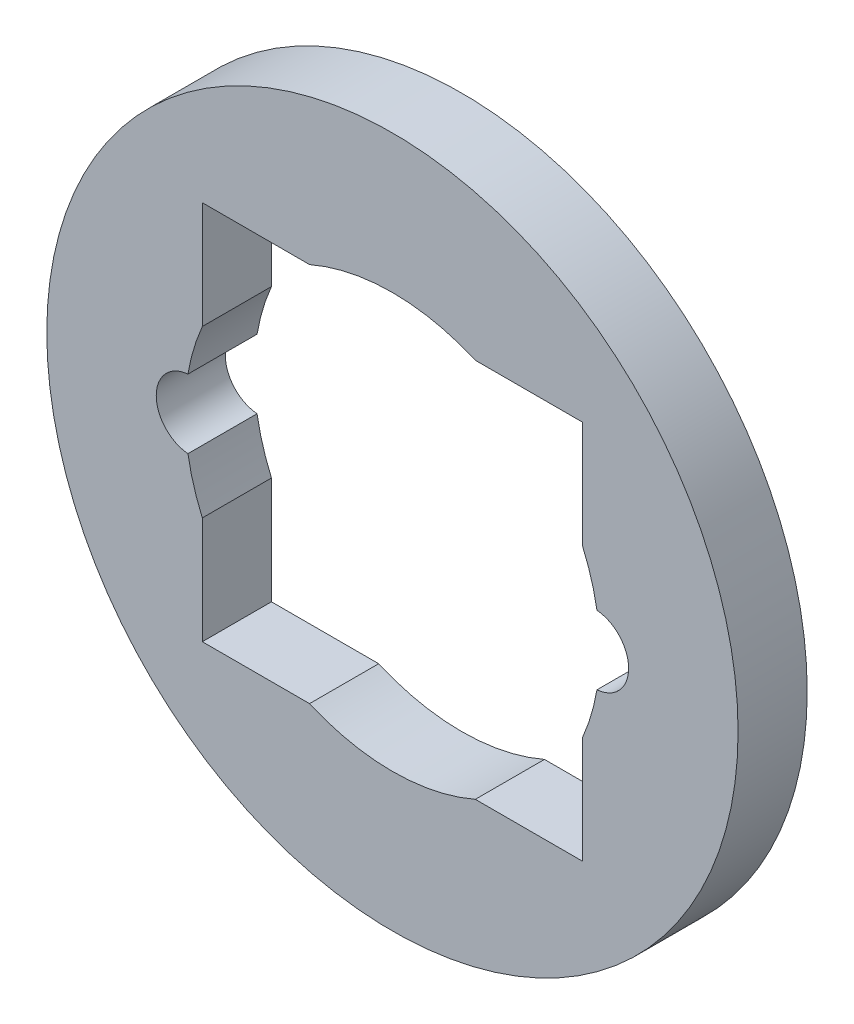
ISO-10303-21;
HEADER;
FILE_DESCRIPTION(('STEP AP214'),'2;1');
FILE_NAME('part.step','',(''),(''),'','','');
FILE_SCHEMA(('AUTOMOTIVE_DESIGN { 1 0 10303 214 1 1 1 1 }'));
ENDSEC;
DATA;
#1=APPLICATION_CONTEXT('core data for automotive mechanical design processes');
#2=APPLICATION_PROTOCOL_DEFINITION('international standard','automotive_design',2000,#1);
#3=PRODUCT_CONTEXT('',#1,'mechanical');
#4=PRODUCT('Part','Part','',(#3));
#5=PRODUCT_RELATED_PRODUCT_CATEGORY('part','',(#4));
#6=PRODUCT_DEFINITION_FORMATION('','',#4);
#7=PRODUCT_DEFINITION_CONTEXT('part definition',#1,'design');
#8=PRODUCT_DEFINITION('design','',#6,#7);
#9=PRODUCT_DEFINITION_SHAPE('','',#8);
#10=(LENGTH_UNIT() NAMED_UNIT(*) SI_UNIT(.MILLI.,.METRE.));
#11=(NAMED_UNIT(*) PLANE_ANGLE_UNIT() SI_UNIT($,.RADIAN.));
#12=(NAMED_UNIT(*) SI_UNIT($,.STERADIAN.) SOLID_ANGLE_UNIT());
#13=UNCERTAINTY_MEASURE_WITH_UNIT(LENGTH_MEASURE(1.E-05),#10,'distance_accuracy_value','');
#14=(GEOMETRIC_REPRESENTATION_CONTEXT(3) GLOBAL_UNCERTAINTY_ASSIGNED_CONTEXT((#13)) GLOBAL_UNIT_ASSIGNED_CONTEXT((#10,
#11,#12)) REPRESENTATION_CONTEXT('',''));
#15=CARTESIAN_POINT('',(0.,0.,0.));
#16=DIRECTION('',(0.,0.,1.));
#17=DIRECTION('',(1.,0.,0.));
#18=AXIS2_PLACEMENT_3D('',#15,#16,#17);
#19=CARTESIAN_POINT('',(0.,0.,3.));
#20=DIRECTION('',(0.,0.,-1.));
#21=DIRECTION('',(-1.,0.,0.));
#22=AXIS2_PLACEMENT_3D('',#19,#20,#21);
#23=CYLINDRICAL_SURFACE('',#22,9.00000000000001);
#24=CARTESIAN_POINT('',(0.,0.,0.));
#25=DIRECTION('',(0.,0.,1.));
#26=DIRECTION('',(1.,0.,0.));
#27=AXIS2_PLACEMENT_3D('',#24,#25,#26);
#28=CIRCLE('',#27,9.00000000000001);
#29=CARTESIAN_POINT('',(8.87499999999998,1.49478259288783,0.));
#30=VERTEX_POINT('',#29);
#31=CARTESIAN_POINT('',(8.25000000000026,3.59687364248397,0.));
#32=VERTEX_POINT('',#31);
#33=EDGE_CURVE('E179',#30,#32,#28,.T.);
#34=ORIENTED_EDGE('',*,*,#33,.F.);
#35=DIRECTION('',(0.,0.,-1.));
#36=VECTOR('',#35,1.);
#37=CARTESIAN_POINT('',(8.87499999999998,1.49478259288783,3.));
#38=LINE('',#37,#36);
#39=CARTESIAN_POINT('',(8.87499999999998,1.49478259288783,3.));
#40=VERTEX_POINT('',#39);
#41=EDGE_CURVE('E11',#40,#30,#38,.T.);
#42=ORIENTED_EDGE('',*,*,#41,.F.);
#43=CARTESIAN_POINT('',(0.,0.,3.));
#44=DIRECTION('',(0.,0.,1.));
#45=DIRECTION('',(1.,0.,0.));
#46=AXIS2_PLACEMENT_3D('',#43,#44,#45);
#47=CIRCLE('',#46,9.00000000000001);
#48=CARTESIAN_POINT('',(8.25000000000026,3.59687364248397,3.));
#49=VERTEX_POINT('',#48);
#50=EDGE_CURVE('E222',#40,#49,#47,.T.);
#51=ORIENTED_EDGE('',*,*,#50,.T.);
#52=DIRECTION('',(0.,0.,-1.));
#53=VECTOR('',#52,1.);
#54=CARTESIAN_POINT('',(8.25000000000026,3.59687364248397,3.));
#55=LINE('',#54,#53);
#56=EDGE_CURVE('E108',#49,#32,#55,.T.);
#57=ORIENTED_EDGE('',*,*,#56,.T.);
#58=EDGE_LOOP('',(#34,#42,#51,#57));
#59=FACE_BOUND('',#58,.T.);
#60=ADVANCED_FACE('F34',(#59),#23,.F.);
#61=CARTESIAN_POINT('',(8.75000000000026,1.31838984174237E-13,3.));
#62=DIRECTION('',(0.,0.,-1.));
#63=DIRECTION('',(-1.,0.,0.));
#64=AXIS2_PLACEMENT_3D('',#61,#62,#63);
#65=CYLINDRICAL_SURFACE('',#64,1.5);
#66=CARTESIAN_POINT('',(8.75000000000026,1.31838984174237E-13,0.));
#67=DIRECTION('',(0.,0.,1.));
#68=DIRECTION('',(1.,0.,0.));
#69=AXIS2_PLACEMENT_3D('',#66,#67,#68);
#70=CIRCLE('',#69,1.5);
#71=CARTESIAN_POINT('',(8.87500000000002,-1.49478259288757,0.));
#72=VERTEX_POINT('',#71);
#73=EDGE_CURVE('E182',#72,#30,#70,.T.);
#74=ORIENTED_EDGE('',*,*,#73,.F.);
#75=DIRECTION('',(0.,0.,-1.));
#76=VECTOR('',#75,1.);
#77=CARTESIAN_POINT('',(8.87500000000002,-1.49478259288757,3.));
#78=LINE('',#77,#76);
#79=CARTESIAN_POINT('',(8.87500000000002,-1.49478259288757,3.));
#80=VERTEX_POINT('',#79);
#81=EDGE_CURVE('E42',#80,#72,#78,.T.);
#82=ORIENTED_EDGE('',*,*,#81,.F.);
#83=CARTESIAN_POINT('',(8.75000000000026,1.31838984174237E-13,3.));
#84=DIRECTION('',(0.,0.,1.));
#85=DIRECTION('',(1.,0.,0.));
#86=AXIS2_PLACEMENT_3D('',#83,#84,#85);
#87=CIRCLE('',#86,1.5);
#88=EDGE_CURVE('E307',#80,#40,#87,.T.);
#89=ORIENTED_EDGE('',*,*,#88,.T.);
#90=ORIENTED_EDGE('',*,*,#41,.T.);
#91=EDGE_LOOP('',(#74,#82,#89,#90));
#92=FACE_BOUND('',#91,.T.);
#93=ADVANCED_FACE('F258',(#92),#65,.F.);
#94=CARTESIAN_POINT('',(0.,0.,3.));
#95=DIRECTION('',(0.,0.,-1.));
#96=DIRECTION('',(-1.,0.,0.));
#97=AXIS2_PLACEMENT_3D('',#94,#95,#96);
#98=CYLINDRICAL_SURFACE('',#97,9.00000000000001);
#99=CARTESIAN_POINT('',(0.,0.,0.));
#100=DIRECTION('',(0.,0.,1.));
#101=DIRECTION('',(1.,0.,0.));
#102=AXIS2_PLACEMENT_3D('',#99,#100,#101);
#103=CIRCLE('',#102,9.00000000000001);
#104=CARTESIAN_POINT('',(8.25000000000026,-3.59687364248397,0.));
#105=VERTEX_POINT('',#104);
#106=EDGE_CURVE('E185',#105,#72,#103,.T.);
#107=ORIENTED_EDGE('',*,*,#106,.F.);
#108=DIRECTION('',(0.,0.,-1.));
#109=VECTOR('',#108,1.);
#110=CARTESIAN_POINT('',(8.25000000000026,-3.59687364248397,3.));
#111=LINE('',#110,#109);
#112=CARTESIAN_POINT('',(8.25000000000026,-3.59687364248397,3.));
#113=VERTEX_POINT('',#112);
#114=EDGE_CURVE('E247',#113,#105,#111,.T.);
#115=ORIENTED_EDGE('',*,*,#114,.F.);
#116=CARTESIAN_POINT('',(0.,0.,3.));
#117=DIRECTION('',(0.,0.,1.));
#118=DIRECTION('',(1.,0.,0.));
#119=AXIS2_PLACEMENT_3D('',#116,#117,#118);
#120=CIRCLE('',#119,9.00000000000001);
#121=EDGE_CURVE('E254',#113,#80,#120,.T.);
#122=ORIENTED_EDGE('',*,*,#121,.T.);
#123=ORIENTED_EDGE('',*,*,#81,.T.);
#124=EDGE_LOOP('',(#107,#115,#122,#123));
#125=FACE_BOUND('',#124,.T.);
#126=ADVANCED_FACE('F252',(#125),#98,.F.);
#127=CARTESIAN_POINT('',(8.25000000000026,-71.8814307783956,3.));
#128=DIRECTION('',(1.,0.,0.));
#129=DIRECTION('',(0.,0.,-1.));
#130=AXIS2_PLACEMENT_3D('',#127,#128,#129);
#131=PLANE('',#130);
#132=DIRECTION('',(0.,-1.,0.));
#133=VECTOR('',#132,1.);
#134=CARTESIAN_POINT('',(8.25000000000026,-71.8814307783956,0.));
#135=LINE('',#134,#133);
#136=CARTESIAN_POINT('',(8.25000000000026,-8.24999999999987,0.));
#137=VERTEX_POINT('',#136);
#138=EDGE_CURVE('E188',#105,#137,#135,.T.);
#139=ORIENTED_EDGE('',*,*,#138,.T.);
#140=DIRECTION('',(0.,0.,-1.));
#141=VECTOR('',#140,1.);
#142=CARTESIAN_POINT('',(8.25000000000026,-8.24999999999987,3.));
#143=LINE('',#142,#141);
#144=CARTESIAN_POINT('',(8.25000000000026,-8.24999999999987,3.));
#145=VERTEX_POINT('',#144);
#146=EDGE_CURVE('E244',#145,#137,#143,.T.);
#147=ORIENTED_EDGE('',*,*,#146,.F.);
#148=DIRECTION('',(0.,-1.,0.));
#149=VECTOR('',#148,1.);
#150=CARTESIAN_POINT('',(8.25000000000026,-71.8814307783956,3.));
#151=LINE('',#150,#149);
#152=EDGE_CURVE('E276',#113,#145,#151,.T.);
#153=ORIENTED_EDGE('',*,*,#152,.F.);
#154=ORIENTED_EDGE('',*,*,#114,.T.);
#155=EDGE_LOOP('',(#139,#147,#153,#154));
#156=FACE_BOUND('',#155,.T.);
#157=ADVANCED_FACE('F266',(#156),#131,.F.);
#158=CARTESIAN_POINT('',(0.784569074154751,-8.24999999999987,3.));
#159=DIRECTION('',(0.,-1.,0.));
#160=DIRECTION('',(0.,0.,-1.));
#161=AXIS2_PLACEMENT_3D('',#158,#159,#160);
#162=PLANE('',#161);
#163=DIRECTION('',(-1.,0.,0.));
#164=VECTOR('',#163,1.);
#165=CARTESIAN_POINT('',(0.784569074154751,-8.24999999999987,0.));
#166=LINE('',#165,#164);
#167=CARTESIAN_POINT('',(3.59687364248484,-8.24999999999987,0.));
#168=VERTEX_POINT('',#167);
#169=EDGE_CURVE('E190',#137,#168,#166,.T.);
#170=ORIENTED_EDGE('',*,*,#169,.T.);
#171=DIRECTION('',(0.,0.,-1.));
#172=VECTOR('',#171,1.);
#173=CARTESIAN_POINT('',(3.59687364248484,-8.24999999999987,3.));
#174=LINE('',#173,#172);
#175=CARTESIAN_POINT('',(3.59687364248484,-8.24999999999987,3.));
#176=VERTEX_POINT('',#175);
#177=EDGE_CURVE('E242',#176,#168,#174,.T.);
#178=ORIENTED_EDGE('',*,*,#177,.F.);
#179=DIRECTION('',(-1.,0.,0.));
#180=VECTOR('',#179,1.);
#181=CARTESIAN_POINT('',(0.784569074154751,-8.24999999999987,3.));
#182=LINE('',#181,#180);
#183=EDGE_CURVE('E272',#145,#176,#182,.T.);
#184=ORIENTED_EDGE('',*,*,#183,.F.);
#185=ORIENTED_EDGE('',*,*,#146,.T.);
#186=EDGE_LOOP('',(#170,#178,#184,#185));
#187=FACE_BOUND('',#186,.T.);
#188=ADVANCED_FACE('F270',(#187),#162,.F.);
#189=CARTESIAN_POINT('',(0.,0.,3.));
#190=DIRECTION('',(0.,0.,-1.));
#191=DIRECTION('',(-1.,0.,0.));
#192=AXIS2_PLACEMENT_3D('',#189,#190,#191);
#193=CYLINDRICAL_SURFACE('',#192,9.);
#194=CARTESIAN_POINT('',(0.,0.,0.));
#195=DIRECTION('',(0.,0.,1.));
#196=DIRECTION('',(1.,0.,0.));
#197=AXIS2_PLACEMENT_3D('',#194,#195,#196);
#198=CIRCLE('',#197,9.);
#199=CARTESIAN_POINT('',(-3.59687364248485,-8.24999999999987,0.));
#200=VERTEX_POINT('',#199);
#201=EDGE_CURVE('E193',#200,#168,#198,.T.);
#202=ORIENTED_EDGE('',*,*,#201,.F.);
#203=DIRECTION('',(0.,0.,-1.));
#204=VECTOR('',#203,1.);
#205=CARTESIAN_POINT('',(-3.59687364248485,-8.24999999999987,3.));
#206=LINE('',#205,#204);
#207=CARTESIAN_POINT('',(-3.59687364248485,-8.24999999999987,3.));
#208=VERTEX_POINT('',#207);
#209=EDGE_CURVE('E240',#208,#200,#206,.T.);
#210=ORIENTED_EDGE('',*,*,#209,.F.);
#211=CARTESIAN_POINT('',(0.,0.,3.));
#212=DIRECTION('',(0.,0.,1.));
#213=DIRECTION('',(1.,0.,0.));
#214=AXIS2_PLACEMENT_3D('',#211,#212,#213);
#215=CIRCLE('',#214,9.);
#216=EDGE_CURVE('E275',#208,#176,#215,.T.);
#217=ORIENTED_EDGE('',*,*,#216,.T.);
#218=ORIENTED_EDGE('',*,*,#177,.T.);
#219=EDGE_LOOP('',(#202,#210,#217,#218));
#220=FACE_BOUND('',#219,.T.);
#221=ADVANCED_FACE('F323',(#220),#193,.F.);
#222=CARTESIAN_POINT('',(0.784569074154751,-8.24999999999987,3.));
#223=DIRECTION('',(0.,-1.,0.));
#224=DIRECTION('',(0.,0.,-1.));
#225=AXIS2_PLACEMENT_3D('',#222,#223,#224);
#226=PLANE('',#225);
#227=DIRECTION('',(-1.,0.,0.));
#228=VECTOR('',#227,1.);
#229=CARTESIAN_POINT('',(0.784569074154751,-8.24999999999987,0.));
#230=LINE('',#229,#228);
#231=CARTESIAN_POINT('',(-8.24999999999976,-8.24999999999987,0.));
#232=VERTEX_POINT('',#231);
#233=EDGE_CURVE('E196',#200,#232,#230,.T.);
#234=ORIENTED_EDGE('',*,*,#233,.T.);
#235=DIRECTION('',(0.,0.,-1.));
#236=VECTOR('',#235,1.);
#237=CARTESIAN_POINT('',(-8.24999999999976,-8.24999999999987,3.));
#238=LINE('',#237,#236);
#239=CARTESIAN_POINT('',(-8.24999999999976,-8.24999999999987,3.));
#240=VERTEX_POINT('',#239);
#241=EDGE_CURVE('E237',#240,#232,#238,.T.);
#242=ORIENTED_EDGE('',*,*,#241,.F.);
#243=DIRECTION('',(-1.,0.,0.));
#244=VECTOR('',#243,1.);
#245=CARTESIAN_POINT('',(0.784569074154751,-8.24999999999987,3.));
#246=LINE('',#245,#244);
#247=EDGE_CURVE('E278',#208,#240,#246,.T.);
#248=ORIENTED_EDGE('',*,*,#247,.F.);
#249=ORIENTED_EDGE('',*,*,#209,.T.);
#250=EDGE_LOOP('',(#234,#242,#248,#249));
#251=FACE_BOUND('',#250,.T.);
#252=ADVANCED_FACE('F326',(#251),#226,.F.);
#253=CARTESIAN_POINT('',(-8.24999999999976,-71.8814307783956,3.));
#254=DIRECTION('',(-1.,0.,0.));
#255=DIRECTION('',(0.,0.,1.));
#256=AXIS2_PLACEMENT_3D('',#253,#254,#255);
#257=PLANE('',#256);
#258=DIRECTION('',(0.,1.,0.));
#259=VECTOR('',#258,1.);
#260=CARTESIAN_POINT('',(-8.24999999999976,-71.8814307783956,0.));
#261=LINE('',#260,#259);
#262=CARTESIAN_POINT('',(-8.24999999999976,-3.59687364248513,0.));
#263=VERTEX_POINT('',#262);
#264=EDGE_CURVE('E198',#232,#263,#261,.T.);
#265=ORIENTED_EDGE('',*,*,#264,.T.);
#266=DIRECTION('',(0.,0.,-1.));
#267=VECTOR('',#266,1.);
#268=CARTESIAN_POINT('',(-8.24999999999976,-3.59687364248513,3.));
#269=LINE('',#268,#267);
#270=CARTESIAN_POINT('',(-8.24999999999976,-3.59687364248513,3.));
#271=VERTEX_POINT('',#270);
#272=EDGE_CURVE('E235',#271,#263,#269,.T.);
#273=ORIENTED_EDGE('',*,*,#272,.F.);
#274=DIRECTION('',(0.,1.,0.));
#275=VECTOR('',#274,1.);
#276=CARTESIAN_POINT('',(-8.24999999999976,-71.8814307783956,3.));
#277=LINE('',#276,#275);
#278=EDGE_CURVE('E284',#240,#271,#277,.T.);
#279=ORIENTED_EDGE('',*,*,#278,.F.);
#280=ORIENTED_EDGE('',*,*,#241,.T.);
#281=EDGE_LOOP('',(#265,#273,#279,#280));
#282=FACE_BOUND('',#281,.T.);
#283=ADVANCED_FACE('F330',(#282),#257,.F.);
#284=CARTESIAN_POINT('',(0.,0.,3.));
#285=DIRECTION('',(0.,0.,-1.));
#286=DIRECTION('',(-1.,0.,0.));
#287=AXIS2_PLACEMENT_3D('',#284,#285,#286);
#288=CYLINDRICAL_SURFACE('',#287,9.00000000000001);
#289=CARTESIAN_POINT('',(0.,0.,0.));
#290=DIRECTION('',(0.,0.,1.));
#291=DIRECTION('',(1.,0.,0.));
#292=AXIS2_PLACEMENT_3D('',#289,#290,#291);
#293=CIRCLE('',#292,9.00000000000001);
#294=CARTESIAN_POINT('',(-8.87500000000004,-1.49478259288753,0.));
#295=VERTEX_POINT('',#294);
#296=EDGE_CURVE('E201',#295,#263,#293,.T.);
#297=ORIENTED_EDGE('',*,*,#296,.F.);
#298=DIRECTION('',(0.,0.,-1.));
#299=VECTOR('',#298,1.);
#300=CARTESIAN_POINT('',(-8.87500000000004,-1.49478259288753,3.));
#301=LINE('',#300,#299);
#302=CARTESIAN_POINT('',(-8.87500000000004,-1.49478259288753,3.));
#303=VERTEX_POINT('',#302);
#304=EDGE_CURVE('E233',#303,#295,#301,.T.);
#305=ORIENTED_EDGE('',*,*,#304,.F.);
#306=CARTESIAN_POINT('',(0.,0.,3.));
#307=DIRECTION('',(0.,0.,1.));
#308=DIRECTION('',(1.,0.,0.));
#309=AXIS2_PLACEMENT_3D('',#306,#307,#308);
#310=CIRCLE('',#309,9.00000000000001);
#311=EDGE_CURVE('E286',#303,#271,#310,.T.);
#312=ORIENTED_EDGE('',*,*,#311,.T.);
#313=ORIENTED_EDGE('',*,*,#272,.T.);
#314=EDGE_LOOP('',(#297,#305,#312,#313));
#315=FACE_BOUND('',#314,.T.);
#316=ADVANCED_FACE('F334',(#315),#288,.F.);
#317=CARTESIAN_POINT('',(-8.74999999999976,1.31838984174237E-13,3.));
#318=DIRECTION('',(0.,0.,-1.));
#319=DIRECTION('',(-1.,0.,0.));
#320=AXIS2_PLACEMENT_3D('',#317,#318,#319);
#321=CYLINDRICAL_SURFACE('',#320,1.50000000000001);
#322=CARTESIAN_POINT('',(-8.74999999999976,1.31838984174237E-13,0.));
#323=DIRECTION('',(0.,0.,1.));
#324=DIRECTION('',(1.,0.,0.));
#325=AXIS2_PLACEMENT_3D('',#322,#323,#324);
#326=CIRCLE('',#325,1.50000000000001);
#327=CARTESIAN_POINT('',(-8.875,1.4947825928878,0.));
#328=VERTEX_POINT('',#327);
#329=EDGE_CURVE('E204',#328,#295,#326,.T.);
#330=ORIENTED_EDGE('',*,*,#329,.F.);
#331=DIRECTION('',(0.,0.,-1.));
#332=VECTOR('',#331,1.);
#333=CARTESIAN_POINT('',(-8.875,1.4947825928878,3.));
#334=LINE('',#333,#332);
#335=CARTESIAN_POINT('',(-8.875,1.4947825928878,3.));
#336=VERTEX_POINT('',#335);
#337=EDGE_CURVE('E231',#336,#328,#334,.T.);
#338=ORIENTED_EDGE('',*,*,#337,.F.);
#339=CARTESIAN_POINT('',(-8.74999999999976,1.31838984174237E-13,3.));
#340=DIRECTION('',(0.,0.,1.));
#341=DIRECTION('',(1.,0.,0.));
#342=AXIS2_PLACEMENT_3D('',#339,#340,#341);
#343=CIRCLE('',#342,1.50000000000001);
#344=EDGE_CURVE('E289',#336,#303,#343,.T.);
#345=ORIENTED_EDGE('',*,*,#344,.T.);
#346=ORIENTED_EDGE('',*,*,#304,.T.);
#347=EDGE_LOOP('',(#330,#338,#345,#346));
#348=FACE_BOUND('',#347,.T.);
#349=ADVANCED_FACE('F338',(#348),#321,.F.);
#350=CARTESIAN_POINT('',(0.,0.,3.));
#351=DIRECTION('',(0.,0.,-1.));
#352=DIRECTION('',(-1.,0.,0.));
#353=AXIS2_PLACEMENT_3D('',#350,#351,#352);
#354=CYLINDRICAL_SURFACE('',#353,9.00000000000001);
#355=CARTESIAN_POINT('',(0.,0.,0.));
#356=DIRECTION('',(0.,0.,1.));
#357=DIRECTION('',(1.,0.,0.));
#358=AXIS2_PLACEMENT_3D('',#355,#356,#357);
#359=CIRCLE('',#358,9.00000000000001);
#360=CARTESIAN_POINT('',(-8.24999999999976,3.59687364248513,0.));
#361=VERTEX_POINT('',#360);
#362=EDGE_CURVE('E207',#361,#328,#359,.T.);
#363=ORIENTED_EDGE('',*,*,#362,.F.);
#364=DIRECTION('',(0.,0.,-1.));
#365=VECTOR('',#364,1.);
#366=CARTESIAN_POINT('',(-8.24999999999976,3.59687364248513,3.));
#367=LINE('',#366,#365);
#368=CARTESIAN_POINT('',(-8.24999999999976,3.59687364248513,3.));
#369=VERTEX_POINT('',#368);
#370=EDGE_CURVE('E229',#369,#361,#367,.T.);
#371=ORIENTED_EDGE('',*,*,#370,.F.);
#372=CARTESIAN_POINT('',(0.,0.,3.));
#373=DIRECTION('',(0.,0.,1.));
#374=DIRECTION('',(1.,0.,0.));
#375=AXIS2_PLACEMENT_3D('',#372,#373,#374);
#376=CIRCLE('',#375,9.00000000000001);
#377=EDGE_CURVE('E292',#369,#336,#376,.T.);
#378=ORIENTED_EDGE('',*,*,#377,.T.);
#379=ORIENTED_EDGE('',*,*,#337,.T.);
#380=EDGE_LOOP('',(#363,#371,#378,#379));
#381=FACE_BOUND('',#380,.T.);
#382=ADVANCED_FACE('F342',(#381),#354,.F.);
#383=CARTESIAN_POINT('',(-8.24999999999976,-71.8814307783956,3.));
#384=DIRECTION('',(-1.,0.,0.));
#385=DIRECTION('',(0.,0.,1.));
#386=AXIS2_PLACEMENT_3D('',#383,#384,#385);
#387=PLANE('',#386);
#388=DIRECTION('',(0.,1.,0.));
#389=VECTOR('',#388,1.);
#390=CARTESIAN_POINT('',(-8.24999999999976,-71.8814307783956,0.));
#391=LINE('',#390,#389);
#392=CARTESIAN_POINT('',(-8.24999999999976,8.25000000000015,0.));
#393=VERTEX_POINT('',#392);
#394=EDGE_CURVE('E210',#361,#393,#391,.T.);
#395=ORIENTED_EDGE('',*,*,#394,.T.);
#396=DIRECTION('',(0.,0.,-1.));
#397=VECTOR('',#396,1.);
#398=CARTESIAN_POINT('',(-8.24999999999976,8.25000000000015,3.));
#399=LINE('',#398,#397);
#400=CARTESIAN_POINT('',(-8.24999999999976,8.25000000000015,3.));
#401=VERTEX_POINT('',#400);
#402=EDGE_CURVE('E226',#401,#393,#399,.T.);
#403=ORIENTED_EDGE('',*,*,#402,.F.);
#404=DIRECTION('',(0.,1.,0.));
#405=VECTOR('',#404,1.);
#406=CARTESIAN_POINT('',(-8.24999999999976,-71.8814307783956,3.));
#407=LINE('',#406,#405);
#408=EDGE_CURVE('E171',#369,#401,#407,.T.);
#409=ORIENTED_EDGE('',*,*,#408,.F.);
#410=ORIENTED_EDGE('',*,*,#370,.T.);
#411=EDGE_LOOP('',(#395,#403,#409,#410));
#412=FACE_BOUND('',#411,.T.);
#413=ADVANCED_FACE('F299',(#412),#387,.F.);
#414=CARTESIAN_POINT('',(0.784569074154751,8.25000000000015,3.));
#415=DIRECTION('',(0.,1.,0.));
#416=DIRECTION('',(0.,0.,1.));
#417=AXIS2_PLACEMENT_3D('',#414,#415,#416);
#418=PLANE('',#417);
#419=DIRECTION('',(1.,0.,0.));
#420=VECTOR('',#419,1.);
#421=CARTESIAN_POINT('',(0.784569074154751,8.25000000000015,0.));
#422=LINE('',#421,#420);
#423=CARTESIAN_POINT('',(-3.5968736424842,8.25000000000015,0.));
#424=VERTEX_POINT('',#423);
#425=EDGE_CURVE('E212',#393,#424,#422,.T.);
#426=ORIENTED_EDGE('',*,*,#425,.T.);
#427=DIRECTION('',(0.,0.,-1.));
#428=VECTOR('',#427,1.);
#429=CARTESIAN_POINT('',(-3.5968736424842,8.25000000000015,3.));
#430=LINE('',#429,#428);
#431=CARTESIAN_POINT('',(-3.5968736424842,8.25000000000015,3.));
#432=VERTEX_POINT('',#431);
#433=EDGE_CURVE('E159',#432,#424,#430,.T.);
#434=ORIENTED_EDGE('',*,*,#433,.F.);
#435=DIRECTION('',(1.,0.,0.));
#436=VECTOR('',#435,1.);
#437=CARTESIAN_POINT('',(0.784569074154751,8.25000000000015,3.));
#438=LINE('',#437,#436);
#439=EDGE_CURVE('E168',#401,#432,#438,.T.);
#440=ORIENTED_EDGE('',*,*,#439,.F.);
#441=ORIENTED_EDGE('',*,*,#402,.T.);
#442=EDGE_LOOP('',(#426,#434,#440,#441));
#443=FACE_BOUND('',#442,.T.);
#444=ADVANCED_FACE('F303',(#443),#418,.F.);
#445=CARTESIAN_POINT('',(0.,0.,3.));
#446=DIRECTION('',(0.,0.,-1.));
#447=DIRECTION('',(-1.,0.,0.));
#448=AXIS2_PLACEMENT_3D('',#445,#446,#447);
#449=CYLINDRICAL_SURFACE('',#448,9.);
#450=CARTESIAN_POINT('',(0.,0.,0.));
#451=DIRECTION('',(0.,0.,1.));
#452=DIRECTION('',(1.,0.,0.));
#453=AXIS2_PLACEMENT_3D('',#450,#451,#452);
#454=CIRCLE('',#453,9.);
#455=CARTESIAN_POINT('',(3.59687364248423,8.25000000000013,0.));
#456=VERTEX_POINT('',#455);
#457=EDGE_CURVE('E158',#456,#424,#454,.T.);
#458=ORIENTED_EDGE('',*,*,#457,.F.);
#459=DIRECTION('',(0.,0.,-1.));
#460=VECTOR('',#459,1.);
#461=CARTESIAN_POINT('',(3.59687364248423,8.25000000000013,3.));
#462=LINE('',#461,#460);
#463=CARTESIAN_POINT('',(3.59687364248423,8.25000000000013,3.));
#464=VERTEX_POINT('',#463);
#465=EDGE_CURVE('E152',#464,#456,#462,.T.);
#466=ORIENTED_EDGE('',*,*,#465,.F.);
#467=CARTESIAN_POINT('',(0.,0.,3.));
#468=DIRECTION('',(0.,0.,1.));
#469=DIRECTION('',(1.,0.,0.));
#470=AXIS2_PLACEMENT_3D('',#467,#468,#469);
#471=CIRCLE('',#470,9.);
#472=EDGE_CURVE('E156',#464,#432,#471,.T.);
#473=ORIENTED_EDGE('',*,*,#472,.T.);
#474=ORIENTED_EDGE('',*,*,#433,.T.);
#475=EDGE_LOOP('',(#458,#466,#473,#474));
#476=FACE_BOUND('',#475,.T.);
#477=ADVANCED_FACE('F154',(#476),#449,.F.);
#478=CARTESIAN_POINT('',(0.784569074154751,8.25000000000013,3.));
#479=DIRECTION('',(0.,1.,0.));
#480=DIRECTION('',(0.,0.,1.));
#481=AXIS2_PLACEMENT_3D('',#478,#479,#480);
#482=PLANE('',#481);
#483=DIRECTION('',(1.,0.,0.));
#484=VECTOR('',#483,1.);
#485=CARTESIAN_POINT('',(0.784569074154751,8.25000000000013,0.));
#486=LINE('',#485,#484);
#487=CARTESIAN_POINT('',(8.25000000000026,8.25000000000013,0.));
#488=VERTEX_POINT('',#487);
#489=EDGE_CURVE('E101',#456,#488,#486,.T.);
#490=ORIENTED_EDGE('',*,*,#489,.T.);
#491=DIRECTION('',(0.,0.,-1.));
#492=VECTOR('',#491,1.);
#493=CARTESIAN_POINT('',(8.25000000000026,8.25000000000013,3.));
#494=LINE('',#493,#492);
#495=CARTESIAN_POINT('',(8.25000000000026,8.25000000000013,3.));
#496=VERTEX_POINT('',#495);
#497=EDGE_CURVE('E160',#496,#488,#494,.T.);
#498=ORIENTED_EDGE('',*,*,#497,.F.);
#499=DIRECTION('',(1.,0.,0.));
#500=VECTOR('',#499,1.);
#501=CARTESIAN_POINT('',(0.784569074154751,8.25000000000013,3.));
#502=LINE('',#501,#500);
#503=EDGE_CURVE('E162',#464,#496,#502,.T.);
#504=ORIENTED_EDGE('',*,*,#503,.F.);
#505=ORIENTED_EDGE('',*,*,#465,.T.);
#506=EDGE_LOOP('',(#490,#498,#504,#505));
#507=FACE_BOUND('',#506,.T.);
#508=ADVANCED_FACE('F163',(#507),#482,.F.);
#509=CARTESIAN_POINT('',(8.25000000000026,-71.8814307783956,3.));
#510=DIRECTION('',(1.,0.,0.));
#511=DIRECTION('',(0.,0.,-1.));
#512=AXIS2_PLACEMENT_3D('',#509,#510,#511);
#513=PLANE('',#512);
#514=DIRECTION('',(0.,-1.,0.));
#515=VECTOR('',#514,1.);
#516=CARTESIAN_POINT('',(8.25000000000026,-71.8814307783956,0.));
#517=LINE('',#516,#515);
#518=EDGE_CURVE('E217',#488,#32,#517,.T.);
#519=ORIENTED_EDGE('',*,*,#518,.T.);
#520=ORIENTED_EDGE('',*,*,#56,.F.);
#521=DIRECTION('',(0.,-1.,0.));
#522=VECTOR('',#521,1.);
#523=CARTESIAN_POINT('',(8.25000000000026,-71.8814307783956,3.));
#524=LINE('',#523,#522);
#525=EDGE_CURVE('E50',#496,#49,#524,.T.);
#526=ORIENTED_EDGE('',*,*,#525,.F.);
#527=ORIENTED_EDGE('',*,*,#497,.T.);
#528=EDGE_LOOP('',(#519,#520,#526,#527));
#529=FACE_BOUND('',#528,.T.);
#530=ADVANCED_FACE('F306',(#529),#513,.F.);
#531=CARTESIAN_POINT('',(0.,0.,3.));
#532=DIRECTION('',(0.,0.,-1.));
#533=DIRECTION('',(-1.,0.,0.));
#534=AXIS2_PLACEMENT_3D('',#531,#532,#533);
#535=CYLINDRICAL_SURFACE('',#534,15.);
#536=CARTESIAN_POINT('',(0.,0.,3.));
#537=DIRECTION('',(0.,0.,1.));
#538=DIRECTION('',(1.,0.,0.));
#539=AXIS2_PLACEMENT_3D('',#536,#537,#538);
#540=CIRCLE('',#539,15.);
#541=CARTESIAN_POINT('',(15.,0.,3.));
#542=VERTEX_POINT('',#541);
#543=EDGE_CURVE('E176',#542,#542,#540,.T.);
#544=ORIENTED_EDGE('',*,*,#543,.F.);
#545=EDGE_LOOP('',(#544));
#546=FACE_BOUND('',#545,.T.);
#547=CARTESIAN_POINT('',(0.,0.,0.));
#548=DIRECTION('',(0.,0.,1.));
#549=DIRECTION('',(1.,0.,0.));
#550=AXIS2_PLACEMENT_3D('',#547,#548,#549);
#551=CIRCLE('',#550,15.);
#552=CARTESIAN_POINT('',(15.,0.,0.));
#553=VERTEX_POINT('',#552);
#554=EDGE_CURVE('E219',#553,#553,#551,.T.);
#555=ORIENTED_EDGE('',*,*,#554,.T.);
#556=EDGE_LOOP('',(#555));
#557=FACE_BOUND('',#556,.T.);
#558=ADVANCED_FACE('F357',(#546,#557),#535,.T.);
#559=CARTESIAN_POINT('',(0.784569074154751,-71.8814307783956,3.));
#560=DIRECTION('',(0.,0.,1.));
#561=DIRECTION('',(1.,0.,0.));
#562=AXIS2_PLACEMENT_3D('',#559,#560,#561);
#563=PLANE('',#562);
#564=ORIENTED_EDGE('',*,*,#50,.F.);
#565=ORIENTED_EDGE('',*,*,#88,.F.);
#566=ORIENTED_EDGE('',*,*,#121,.F.);
#567=ORIENTED_EDGE('',*,*,#152,.T.);
#568=ORIENTED_EDGE('',*,*,#183,.T.);
#569=ORIENTED_EDGE('',*,*,#216,.F.);
#570=ORIENTED_EDGE('',*,*,#247,.T.);
#571=ORIENTED_EDGE('',*,*,#278,.T.);
#572=ORIENTED_EDGE('',*,*,#311,.F.);
#573=ORIENTED_EDGE('',*,*,#344,.F.);
#574=ORIENTED_EDGE('',*,*,#377,.F.);
#575=ORIENTED_EDGE('',*,*,#408,.T.);
#576=ORIENTED_EDGE('',*,*,#439,.T.);
#577=ORIENTED_EDGE('',*,*,#472,.F.);
#578=ORIENTED_EDGE('',*,*,#503,.T.);
#579=ORIENTED_EDGE('',*,*,#525,.T.);
#580=EDGE_LOOP('',(#564,#565,#566,#567,#568,#569,#570,#571,#572,#573,#574,#575,#576,#577,#578,#579));
#581=FACE_BOUND('',#580,.T.);
#582=ORIENTED_EDGE('',*,*,#543,.T.);
#583=EDGE_LOOP('',(#582));
#584=FACE_BOUND('',#583,.T.);
#585=ADVANCED_FACE('F165',(#581,#584),#563,.T.);
#586=CARTESIAN_POINT('',(0.784569074154751,-71.8814307783956,0.));
#587=DIRECTION('',(0.,0.,1.));
#588=DIRECTION('',(1.,0.,0.));
#589=AXIS2_PLACEMENT_3D('',#586,#587,#588);
#590=PLANE('',#589);
#591=ORIENTED_EDGE('',*,*,#33,.T.);
#592=ORIENTED_EDGE('',*,*,#518,.F.);
#593=ORIENTED_EDGE('',*,*,#489,.F.);
#594=ORIENTED_EDGE('',*,*,#457,.T.);
#595=ORIENTED_EDGE('',*,*,#425,.F.);
#596=ORIENTED_EDGE('',*,*,#394,.F.);
#597=ORIENTED_EDGE('',*,*,#362,.T.);
#598=ORIENTED_EDGE('',*,*,#329,.T.);
#599=ORIENTED_EDGE('',*,*,#296,.T.);
#600=ORIENTED_EDGE('',*,*,#264,.F.);
#601=ORIENTED_EDGE('',*,*,#233,.F.);
#602=ORIENTED_EDGE('',*,*,#201,.T.);
#603=ORIENTED_EDGE('',*,*,#169,.F.);
#604=ORIENTED_EDGE('',*,*,#138,.F.);
#605=ORIENTED_EDGE('',*,*,#106,.T.);
#606=ORIENTED_EDGE('',*,*,#73,.T.);
#607=EDGE_LOOP('',(#591,#592,#593,#594,#595,#596,#597,#598,#599,#600,#601,#602,#603,#604,#605,#606));
#608=FACE_BOUND('',#607,.T.);
#609=ORIENTED_EDGE('',*,*,#554,.F.);
#610=EDGE_LOOP('',(#609));
#611=FACE_BOUND('',#610,.T.);
#612=ADVANCED_FACE('F261',(#608,#611),#590,.F.);
#613=CLOSED_SHELL('',(#60,#93,#126,#157,#188,#221,#252,#283,#316,#349,#382,#413,#444,#477,#508,
#530,#558,#585,#612));
#614=MANIFOLD_SOLID_BREP('B2',#613);
#615=ADVANCED_BREP_SHAPE_REPRESENTATION('',(#18,#614),#14);
#616=SHAPE_DEFINITION_REPRESENTATION(#9,#615);
ENDSEC;
END-ISO-10303-21;
